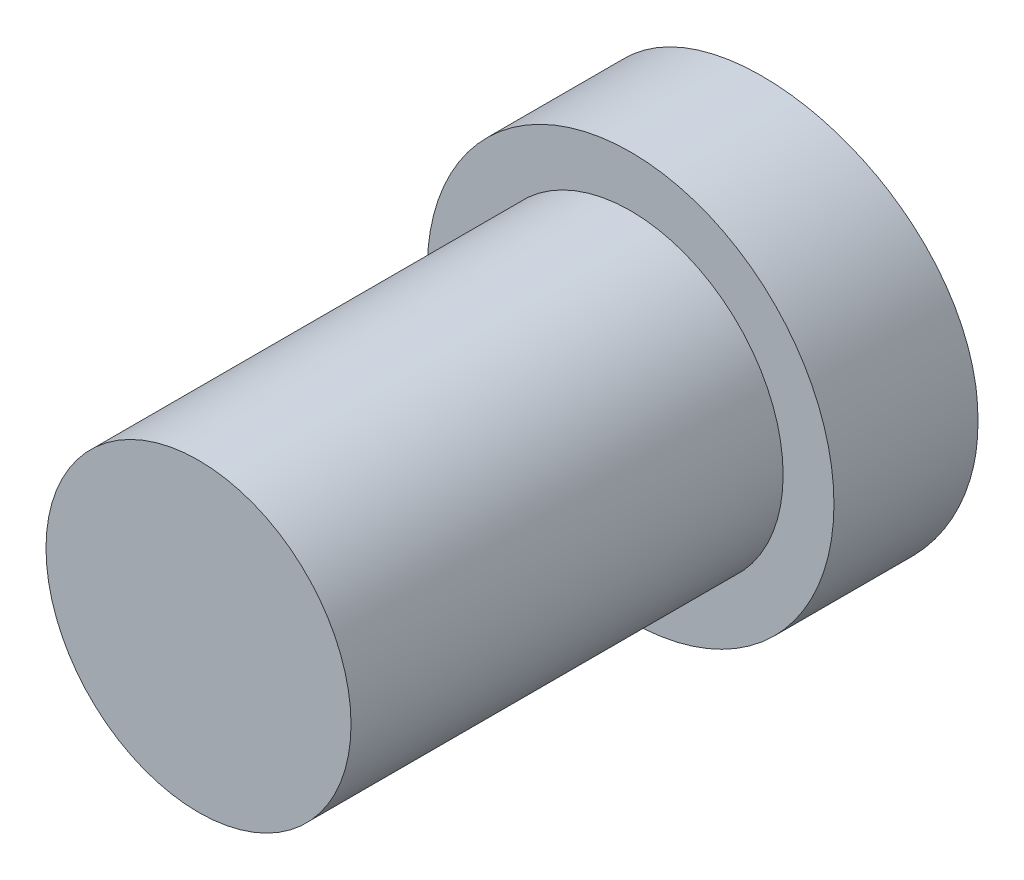
ISO-10303-21;
HEADER;
FILE_DESCRIPTION(('STEP AP214'),'2;1');
FILE_NAME('part.step','',(''),(''),'','','');
FILE_SCHEMA(('AUTOMOTIVE_DESIGN { 1 0 10303 214 1 1 1 1 }'));
ENDSEC;
DATA;
#1=APPLICATION_CONTEXT('core data for automotive mechanical design processes');
#2=APPLICATION_PROTOCOL_DEFINITION('international standard','automotive_design',2000,#1);
#3=PRODUCT_CONTEXT('',#1,'mechanical');
#4=PRODUCT('Part','Part','',(#3));
#5=PRODUCT_RELATED_PRODUCT_CATEGORY('part','',(#4));
#6=PRODUCT_DEFINITION_FORMATION('','',#4);
#7=PRODUCT_DEFINITION_CONTEXT('part definition',#1,'design');
#8=PRODUCT_DEFINITION('design','',#6,#7);
#9=PRODUCT_DEFINITION_SHAPE('','',#8);
#10=(LENGTH_UNIT() NAMED_UNIT(*) SI_UNIT(.MILLI.,.METRE.));
#11=(NAMED_UNIT(*) PLANE_ANGLE_UNIT() SI_UNIT($,.RADIAN.));
#12=(NAMED_UNIT(*) SI_UNIT($,.STERADIAN.) SOLID_ANGLE_UNIT());
#13=UNCERTAINTY_MEASURE_WITH_UNIT(LENGTH_MEASURE(1.E-05),#10,'distance_accuracy_value','');
#14=(GEOMETRIC_REPRESENTATION_CONTEXT(3) GLOBAL_UNCERTAINTY_ASSIGNED_CONTEXT((#13)) GLOBAL_UNIT_ASSIGNED_CONTEXT((#10,
#11,#12)) REPRESENTATION_CONTEXT('',''));
#15=CARTESIAN_POINT('',(0.,0.,0.));
#16=DIRECTION('',(0.,0.,1.));
#17=DIRECTION('',(1.,0.,0.));
#18=AXIS2_PLACEMENT_3D('',#15,#16,#17);
#19=CARTESIAN_POINT('',(0.,0.,17.));
#20=DIRECTION('',(0.,0.,-1.));
#21=DIRECTION('',(-1.,0.,0.));
#22=AXIS2_PLACEMENT_3D('',#19,#20,#21);
#23=CYLINDRICAL_SURFACE('',#22,4.5);
#24=CARTESIAN_POINT('',(0.,0.,4.25));
#25=DIRECTION('',(0.,0.,1.));
#26=DIRECTION('',(1.,0.,0.));
#27=AXIS2_PLACEMENT_3D('',#24,#25,#26);
#28=CIRCLE('',#27,4.5);
#29=CARTESIAN_POINT('',(4.5,0.,4.25));
#30=VERTEX_POINT('',#29);
#31=EDGE_CURVE('E74',#30,#30,#28,.T.);
#32=ORIENTED_EDGE('',*,*,#31,.T.);
#33=EDGE_LOOP('',(#32));
#34=FACE_BOUND('',#33,.T.);
#35=CARTESIAN_POINT('',(0.,0.,17.));
#36=DIRECTION('',(0.,0.,1.));
#37=DIRECTION('',(1.,0.,0.));
#38=AXIS2_PLACEMENT_3D('',#35,#36,#37);
#39=CIRCLE('',#38,4.5);
#40=CARTESIAN_POINT('',(4.5,0.,17.));
#41=VERTEX_POINT('',#40);
#42=EDGE_CURVE('E72',#41,#41,#39,.T.);
#43=ORIENTED_EDGE('',*,*,#42,.F.);
#44=EDGE_LOOP('',(#43));
#45=FACE_BOUND('',#44,.T.);
#46=ADVANCED_FACE('F37',(#34,#45),#23,.T.);
#47=CARTESIAN_POINT('',(0.,0.,17.));
#48=DIRECTION('',(0.,0.,1.));
#49=DIRECTION('',(1.,0.,0.));
#50=AXIS2_PLACEMENT_3D('',#47,#48,#49);
#51=PLANE('',#50);
#52=ORIENTED_EDGE('',*,*,#42,.T.);
#53=EDGE_LOOP('',(#52));
#54=FACE_BOUND('',#53,.T.);
#55=ADVANCED_FACE('F96',(#54),#51,.T.);
#56=CARTESIAN_POINT('',(0.,0.,4.25));
#57=DIRECTION('',(0.,0.,1.));
#58=DIRECTION('',(1.,0.,0.));
#59=AXIS2_PLACEMENT_3D('',#56,#57,#58);
#60=PLANE('',#59);
#61=CARTESIAN_POINT('',(0.,0.,4.25));
#62=DIRECTION('',(0.,0.,1.));
#63=DIRECTION('',(1.,0.,0.));
#64=AXIS2_PLACEMENT_3D('',#61,#62,#63);
#65=CIRCLE('',#64,6.);
#66=CARTESIAN_POINT('',(6.,0.,4.25));
#67=VERTEX_POINT('',#66);
#68=EDGE_CURVE('E76',#67,#67,#65,.T.);
#69=ORIENTED_EDGE('',*,*,#68,.T.);
#70=EDGE_LOOP('',(#69));
#71=FACE_BOUND('',#70,.T.);
#72=ORIENTED_EDGE('',*,*,#31,.F.);
#73=EDGE_LOOP('',(#72));
#74=FACE_BOUND('',#73,.T.);
#75=ADVANCED_FACE('F87',(#71,#74),#60,.T.);
#76=CARTESIAN_POINT('',(0.,0.,4.25));
#77=DIRECTION('',(0.,0.,-1.));
#78=DIRECTION('',(-1.,0.,0.));
#79=AXIS2_PLACEMENT_3D('',#76,#77,#78);
#80=CYLINDRICAL_SURFACE('',#79,6.);
#81=ORIENTED_EDGE('',*,*,#68,.F.);
#82=EDGE_LOOP('',(#81));
#83=FACE_BOUND('',#82,.T.);
#84=CARTESIAN_POINT('',(0.,0.,0.));
#85=DIRECTION('',(0.,0.,1.));
#86=DIRECTION('',(1.,0.,0.));
#87=AXIS2_PLACEMENT_3D('',#84,#85,#86);
#88=CIRCLE('',#87,6.);
#89=CARTESIAN_POINT('',(5.94043800538457,-0.843324554476254,0.));
#90=VERTEX_POINT('',#89);
#91=CARTESIAN_POINT('',(5.94043800538457,0.843324554476254,0.));
#92=VERTEX_POINT('',#91);
#93=EDGE_CURVE('E66',#90,#92,#88,.T.);
#94=ORIENTED_EDGE('',*,*,#93,.T.);
#95=CARTESIAN_POINT('',(5.94043800538457,0.843324554476254,0.));
#96=CARTESIAN_POINT('',(5.91677642733934,1.01013088972609,0.00293024071461757));
#97=CARTESIAN_POINT('',(5.88605596566407,1.17591498856815,0.00673077304603096));
#98=CARTESIAN_POINT('',(5.81080943156231,1.50426035828322,0.0159286948526426));
#99=CARTESIAN_POINT('',(5.76628456013719,1.66682190821359,0.0213259454094368));
#100=CARTESIAN_POINT('',(5.66378694965089,1.98741744846943,0.0335681878827217));
#101=CARTESIAN_POINT('',(5.60582731662964,2.14545568370893,0.040411768287692));
#102=CARTESIAN_POINT('',(5.47686619801592,2.4560554224881,0.055354394981101));
#103=CARTESIAN_POINT('',(5.40586474133532,2.60861693816799,0.0634534384863511));
#104=CARTESIAN_POINT('',(5.25132368047521,2.90720892407216,0.0806808901688044));
#105=CARTESIAN_POINT('',(5.16778285777555,3.05323875778441,0.0898093983633755));
#106=CARTESIAN_POINT('',(4.98873144272483,3.33778755005306,0.108842421221449));
#107=CARTESIAN_POINT('',(4.8932164366517,3.4763037119333,0.118747221521477));
#108=CARTESIAN_POINT('',(4.69096110943997,3.74474474176435,0.139047644647634));
#109=CARTESIAN_POINT('',(4.58422590592268,3.87467348284033,0.149443042526288));
#110=CARTESIAN_POINT('',(4.36019900950642,4.1251554488433,0.170441604476649));
#111=CARTESIAN_POINT('',(4.24290342000339,4.24570518223722,0.181044844100209));
#112=CARTESIAN_POINT('',(3.99808026007789,4.477034553754,0.202203215023437));
#113=CARTESIAN_POINT('',(3.87051097825322,4.58777008892451,0.212757945173269));
#114=CARTESIAN_POINT('',(3.60642375719084,4.79814739237764,0.233477672614563));
#115=CARTESIAN_POINT('',(3.46990252018668,4.89778503547096,0.243642524070116));
#116=CARTESIAN_POINT('',(3.18894297312562,5.08518930577852,0.263286408415989));
#117=CARTESIAN_POINT('',(3.04450660166614,5.17295882166896,0.27276560793031));
#118=CARTESIAN_POINT('',(2.7486451840167,5.33605599379873,0.290773059533175));
#119=CARTESIAN_POINT('',(2.59721758809804,5.41137906416945,0.299300960743361));
#120=CARTESIAN_POINT('',(2.28862340890531,5.54893834787478,0.315149630642946));
#121=CARTESIAN_POINT('',(2.13146180263916,5.6111856078426,0.322471417137587));
#122=CARTESIAN_POINT('',(1.81233504533732,5.72223693018864,0.335707546337629));
#123=CARTESIAN_POINT('',(1.65036814259922,5.7710360218429,0.341621368520393));
#124=CARTESIAN_POINT('',(1.32291981780095,5.85477830277397,0.351863898359647));
#125=CARTESIAN_POINT('',(1.15744002090128,5.88972775818029,0.35619332279308));
#126=CARTESIAN_POINT('',(0.824027775131172,5.94554939854173,0.363145755364356));
#127=CARTESIAN_POINT('',(0.656094498621909,5.9664167156224,0.365768173417888));
#128=CARTESIAN_POINT('',(0.320251024344622,5.99379861981964,0.369215130017763));
#129=CARTESIAN_POINT('',(0.15234921358913,6.0004145661168,0.370052364781809));
#130=CARTESIAN_POINT('',(-0.183417181435392,5.99954521637311,0.369942555349901));
#131=CARTESIAN_POINT('',(-0.35128176580402,5.99205995852554,0.368995515986674));
#132=CARTESIAN_POINT('',(-0.685801436375886,5.96304181572248,0.365344213062507));
#133=CARTESIAN_POINT('',(-0.852456312492545,5.941506547094,0.362639651327116));
#134=CARTESIAN_POINT('',(-1.18328157936703,5.88455667102528,0.355552302537452));
#135=CARTESIAN_POINT('',(-1.34745280761388,5.84914685556203,0.351170094918809));
#136=CARTESIAN_POINT('',(-1.6718414553961,5.76480433654719,0.340864939199222));
#137=CARTESIAN_POINT('',(-1.83206689115426,5.71590203154439,0.334945456316858));
#138=CARTESIAN_POINT('',(-2.1477615986099,5.60491795623095,0.321732255266379));
#139=CARTESIAN_POINT('',(-2.30323257620948,5.54284097801187,0.314439036882343));
#140=CARTESIAN_POINT('',(-2.6084540289455,5.40591852691672,0.298680640687631));
#141=CARTESIAN_POINT('',(-2.75820234429682,5.33106829042248,0.290215025869963));
#142=CARTESIAN_POINT('',(-3.0508283902215,5.16917751283063,0.272355862561678));
#143=CARTESIAN_POINT('',(-3.19370856207247,5.08214134690455,0.262962647466865));
#144=CARTESIAN_POINT('',(-3.47252837336416,4.89589885004706,0.24344921036951));
#145=CARTESIAN_POINT('',(-3.60841998167321,4.79662103756754,0.233324876573355));
#146=CARTESIAN_POINT('',(-3.8713214485145,4.58705991081214,0.212690493279756));
#147=CARTESIAN_POINT('',(-3.99833449714539,4.4767805843477,0.202180584412056));
#148=CARTESIAN_POINT('',(-4.24272237947015,4.24588996802773,0.181061147996236));
#149=CARTESIAN_POINT('',(-4.36009171323908,4.12527286142963,0.170451567394933));
#150=CARTESIAN_POINT('',(-4.58425385929102,3.87464478082186,0.149440516563629));
#151=CARTESIAN_POINT('',(-4.69105053029149,3.74463726422801,0.139038971520889));
#152=CARTESIAN_POINT('',(-4.89397312833835,3.47528811370461,0.118670967741575));
#153=CARTESIAN_POINT('',(-4.99003159857565,3.33589542377031,0.108707474669093));
#154=CARTESIAN_POINT('',(-5.17001872377311,3.04950804438188,0.089568403984952));
#155=CARTESIAN_POINT('',(-5.2539518674405,2.90251619558505,0.0803925353136466));
#156=CARTESIAN_POINT('',(-5.40907427657606,2.6020158885669,0.0630908532018045));
#157=CARTESIAN_POINT('',(-5.48027172163848,2.44851169190393,0.054964366727604));
#158=CARTESIAN_POINT('',(-5.60944703502118,2.13604258298197,0.039987541949072));
#159=CARTESIAN_POINT('',(-5.66742973129011,1.97707968953563,0.0331367377479049));
#160=CARTESIAN_POINT('',(-5.76900951630262,1.65718284532923,0.0209965650907786));
#161=CARTESIAN_POINT('',(-5.81280862593306,1.49631384549054,0.0156853934208172));
#162=CARTESIAN_POINT('',(-5.88682909900196,1.17173356633767,0.00663527128809052));
#163=CARTESIAN_POINT('',(-5.9170739170751,1.00802770999909,0.00289360564268412));
#164=CARTESIAN_POINT('',(-5.94043800538457,0.843324554476255,0.));
#165=B_SPLINE_CURVE_WITH_KNOTS('',3,(#95,#96,#97,#98,#99,#100,#101,#102,#103,#104,#105,#106,
#107,#108,#109,#110,#111,#112,#113,#114,#115,#116,#117,#118,#119,#120,#121,#122,#123,#124,#125,
#126,#127,#128,#129,#130,#131,#132,#133,#134,#135,#136,#137,#138,#139,#140,#141,#142,#143,#144,
#145,#146,#147,#148,#149,#150,#151,#152,#153,#154,#155,#156,#157,#158,#159,#160,#161,#162,#163,
#164),.UNSPECIFIED.,.F.,.F.,(4,2,2,2,2,2,2,2,2,2,2,2,2,2,2,2,2,2,2,2,2,2,2,2,2,2,2,2,2,2,2,2,2,
2,4),(0.,0.505345757941087,1.0106475624845,1.51545848822533,2.02026829488593,2.52512718852942,
3.03017272496311,3.53498889745434,4.03999210801478,4.54716040974031,5.05451660588502,
5.56174908949935,6.06916804721624,6.57615659056916,7.08333227690461,7.59027823396174,
8.09739934104775,8.6009016060993,9.10440250741073,9.607988853048,10.1114014236342,
10.6136889402054,11.1157940693247,11.6180868627926,12.1201997759822,12.6253973795941,
13.1304125207971,13.6357137073807,14.1408297883757,14.6489591348097,15.1568998907833,
15.6645132375784,16.1719408317787,16.6717857791028,17.1707624123992),.UNSPECIFIED.);
#166=CARTESIAN_POINT('',(-5.94043800538457,0.843324554476254,0.));
#167=VERTEX_POINT('',#166);
#168=EDGE_CURVE('E57',#92,#167,#165,.T.);
#169=ORIENTED_EDGE('',*,*,#168,.T.);
#170=CARTESIAN_POINT('',(-5.94043800538457,-0.843324554476254,0.));
#171=VERTEX_POINT('',#170);
#172=EDGE_CURVE('E68',#167,#171,#88,.T.);
#173=ORIENTED_EDGE('',*,*,#172,.T.);
#174=CARTESIAN_POINT('',(-5.94043800538457,-0.843324554476254,0.));
#175=CARTESIAN_POINT('',(-5.91677642733934,-1.01013088972609,0.00293024071461774));
#176=CARTESIAN_POINT('',(-5.88605596566407,-1.17591498856815,0.00673077304603124));
#177=CARTESIAN_POINT('',(-5.81080943156231,-1.50426035828322,0.015928694852643));
#178=CARTESIAN_POINT('',(-5.76628456013719,-1.66682190821359,0.0213259454094372));
#179=CARTESIAN_POINT('',(-5.66378694965089,-1.98741744846943,0.0335681878827221));
#180=CARTESIAN_POINT('',(-5.60582731662964,-2.14545568370893,0.0404117682876923));
#181=CARTESIAN_POINT('',(-5.47686619801592,-2.4560554224881,0.0553543949811012));
#182=CARTESIAN_POINT('',(-5.40586474133532,-2.60861693816799,0.0634534384863512));
#183=CARTESIAN_POINT('',(-5.25132368047521,-2.90720892407216,0.0806808901688044));
#184=CARTESIAN_POINT('',(-5.16778285777555,-3.05323875778441,0.0898093983633755));
#185=CARTESIAN_POINT('',(-4.98873144272483,-3.33778755005306,0.108842421221448));
#186=CARTESIAN_POINT('',(-4.8932164366517,-3.4763037119333,0.118747221521477));
#187=CARTESIAN_POINT('',(-4.69096110943997,-3.74474474176435,0.139047644647634));
#188=CARTESIAN_POINT('',(-4.58422590592268,-3.87467348284033,0.149443042526288));
#189=CARTESIAN_POINT('',(-4.36019900950642,-4.1251554488433,0.170441604476649));
#190=CARTESIAN_POINT('',(-4.24290342000339,-4.24570518223722,0.181044844100208));
#191=CARTESIAN_POINT('',(-3.99808026007789,-4.477034553754,0.202203215023437));
#192=CARTESIAN_POINT('',(-3.87051097825322,-4.58777008892451,0.212757945173269));
#193=CARTESIAN_POINT('',(-3.60642375719084,-4.79814739237764,0.233477672614564));
#194=CARTESIAN_POINT('',(-3.46990252018668,-4.89778503547096,0.243642524070118));
#195=CARTESIAN_POINT('',(-3.18894297312562,-5.08518930577852,0.263286408415989));
#196=CARTESIAN_POINT('',(-3.04450660166614,-5.17295882166896,0.272765607930309));
#197=CARTESIAN_POINT('',(-2.7486451840167,-5.33605599379873,0.290773059533174));
#198=CARTESIAN_POINT('',(-2.59721758809804,-5.41137906416945,0.299300960743362));
#199=CARTESIAN_POINT('',(-2.28862340890531,-5.54893834787478,0.315149630642946));
#200=CARTESIAN_POINT('',(-2.13146180263916,-5.6111856078426,0.322471417137585));
#201=CARTESIAN_POINT('',(-1.81233504533733,-5.72223693018864,0.335707546337631));
#202=CARTESIAN_POINT('',(-1.65036814259922,-5.7710360218429,0.341621368520401));
#203=CARTESIAN_POINT('',(-1.32291981780095,-5.85477830277397,0.351863898359659));
#204=CARTESIAN_POINT('',(-1.15744002090128,-5.88972775818029,0.356193322793089));
#205=CARTESIAN_POINT('',(-0.824027775131172,-5.94554939854173,0.363145755364356));
#206=CARTESIAN_POINT('',(-0.656094498621909,-5.9664167156224,0.365768173417882));
#207=CARTESIAN_POINT('',(-0.320251024344621,-5.99379861981964,0.369215130017755));
#208=CARTESIAN_POINT('',(-0.15234921358913,-6.0004145661168,0.370052364781807));
#209=CARTESIAN_POINT('',(0.183417181435392,-5.99954521637311,0.369942555349901));
#210=CARTESIAN_POINT('',(0.35128176580402,-5.99205995852554,0.368995515986671));
#211=CARTESIAN_POINT('',(0.685801436375886,-5.96304181572248,0.365344213062503));
#212=CARTESIAN_POINT('',(0.852456312492546,-5.941506547094,0.362639651327114));
#213=CARTESIAN_POINT('',(1.18328157936703,-5.88455667102528,0.355552302537453));
#214=CARTESIAN_POINT('',(1.34745280761388,-5.84914685556203,0.351170094918809));
#215=CARTESIAN_POINT('',(1.6718414553961,-5.76480433654719,0.340864939199223));
#216=CARTESIAN_POINT('',(1.83206689115426,-5.71590203154439,0.334945456316859));
#217=CARTESIAN_POINT('',(2.1477615986099,-5.60491795623095,0.32173225526638));
#218=CARTESIAN_POINT('',(2.30323257620948,-5.54284097801187,0.314439036882345));
#219=CARTESIAN_POINT('',(2.6084540289455,-5.40591852691672,0.298680640687633));
#220=CARTESIAN_POINT('',(2.75820234429682,-5.33106829042248,0.290215025869964));
#221=CARTESIAN_POINT('',(3.0508283902215,-5.16917751283064,0.272355862561679));
#222=CARTESIAN_POINT('',(3.19370856207247,-5.08214134690455,0.262962647466866));
#223=CARTESIAN_POINT('',(3.47252837336416,-4.89589885004706,0.243449210369511));
#224=CARTESIAN_POINT('',(3.60841998167321,-4.79662103756754,0.233324876573356));
#225=CARTESIAN_POINT('',(3.8713214485145,-4.58705991081214,0.212690493279757));
#226=CARTESIAN_POINT('',(3.99833449714539,-4.4767805843477,0.202180584412057));
#227=CARTESIAN_POINT('',(4.24272237947015,-4.24588996802773,0.181061147996236));
#228=CARTESIAN_POINT('',(4.36009171323907,-4.12527286142963,0.170451567394933));
#229=CARTESIAN_POINT('',(4.58425385929102,-3.87464478082186,0.149440516563628));
#230=CARTESIAN_POINT('',(4.69105053029149,-3.74463726422801,0.139038971520889));
#231=CARTESIAN_POINT('',(4.89397312833835,-3.47528811370461,0.118670967741577));
#232=CARTESIAN_POINT('',(4.99003159857565,-3.33589542377031,0.108707474669098));
#233=CARTESIAN_POINT('',(5.17001872377311,-3.04950804438188,0.089568403984954));
#234=CARTESIAN_POINT('',(5.2539518674405,-2.90251619558505,0.0803925353136424));
#235=CARTESIAN_POINT('',(5.40907427657606,-2.6020158885669,0.0630908532017968));
#236=CARTESIAN_POINT('',(5.48027172163848,-2.44851169190393,0.0549643667275991));
#237=CARTESIAN_POINT('',(5.60944703502118,-2.13604258298198,0.0399875419490711));
#238=CARTESIAN_POINT('',(5.66742973129011,-1.97707968953563,0.0331367377479054));
#239=CARTESIAN_POINT('',(5.76900951630262,-1.65718284532923,0.0209965650907801));
#240=CARTESIAN_POINT('',(5.81280862593306,-1.49631384549054,0.0156853934208185));
#241=CARTESIAN_POINT('',(5.88682909900196,-1.17173356633768,0.00663527128809127));
#242=CARTESIAN_POINT('',(5.9170739170751,-1.00802770999909,0.0028936056426846));
#243=CARTESIAN_POINT('',(5.94043800538457,-0.843324554476256,0.));
#244=B_SPLINE_CURVE_WITH_KNOTS('',3,(#174,#175,#176,#177,#178,#179,#180,#181,#182,#183,#184,
#185,#186,#187,#188,#189,#190,#191,#192,#193,#194,#195,#196,#197,#198,#199,#200,#201,#202,#203,
#204,#205,#206,#207,#208,#209,#210,#211,#212,#213,#214,#215,#216,#217,#218,#219,#220,#221,#222,
#223,#224,#225,#226,#227,#228,#229,#230,#231,#232,#233,#234,#235,#236,#237,#238,#239,#240,#241,
#242,#243),.UNSPECIFIED.,.F.,.F.,(4,2,2,2,2,2,2,2,2,2,2,2,2,2,2,2,2,2,2,2,2,2,2,2,2,2,2,2,2,2,2,
2,2,2,4),(0.,0.505345757941087,1.0106475624845,1.51545848822533,2.02026829488593,
2.52512718852942,3.03017272496311,3.53498889745434,4.03999210801478,4.54716040974031,
5.05451660588502,5.56174908949935,6.06916804721624,6.57615659056916,7.08333227690461,
7.59027823396174,8.09739934104775,8.6009016060993,9.10440250741073,9.607988853048,
10.1114014236342,10.6136889402054,11.1157940693247,11.6180868627926,12.1201997759822,
12.6253973795941,13.1304125207971,13.6357137073807,14.1408297883757,14.6489591348097,
15.1568998907833,15.6645132375784,16.1719408317787,16.6717857791028,17.1707624123992),.UNSPECIFIED.);
#245=EDGE_CURVE('E50',#171,#90,#244,.T.);
#246=ORIENTED_EDGE('',*,*,#245,.T.);
#247=EDGE_LOOP('',(#94,#169,#173,#246));
#248=FACE_BOUND('',#247,.T.);
#249=ADVANCED_FACE('F64',(#83,#248),#80,.T.);
#250=CARTESIAN_POINT('',(0.,0.,0.));
#251=DIRECTION('',(0.,0.,1.));
#252=DIRECTION('',(1.,0.,0.));
#253=AXIS2_PLACEMENT_3D('',#250,#251,#252);
#254=PLANE('',#253);
#255=ORIENTED_EDGE('',*,*,#172,.F.);
#256=DIRECTION('',(1.,0.,0.));
#257=VECTOR('',#256,1.);
#258=CARTESIAN_POINT('',(-6.,0.843324554476254,0.));
#259=LINE('',#258,#257);
#260=EDGE_CURVE('E11',#167,#92,#259,.T.);
#261=ORIENTED_EDGE('',*,*,#260,.T.);
#262=ORIENTED_EDGE('',*,*,#93,.F.);
#263=DIRECTION('',(1.,0.,0.));
#264=VECTOR('',#263,1.);
#265=CARTESIAN_POINT('',(-6.,-0.843324554476254,0.));
#266=LINE('',#265,#264);
#267=EDGE_CURVE('E44',#90,#171,#266,.F.);
#268=ORIENTED_EDGE('',*,*,#267,.T.);
#269=EDGE_LOOP('',(#255,#261,#262,#268));
#270=FACE_BOUND('',#269,.T.);
#271=ADVANCED_FACE('F73',(#270),#254,.F.);
#272=CARTESIAN_POINT('',(-6.,0.,47.872572561915));
#273=DIRECTION('',(1.,0.,0.));
#274=DIRECTION('',(0.,0.,-1.));
#275=AXIS2_PLACEMENT_3D('',#272,#273,#274);
#276=CYLINDRICAL_SURFACE('',#275,47.88);
#277=ORIENTED_EDGE('',*,*,#267,.F.);
#278=ORIENTED_EDGE('',*,*,#245,.F.);
#279=EDGE_LOOP('',(#277,#278));
#280=FACE_BOUND('',#279,.T.);
#281=ADVANCED_FACE('F70',(#280),#276,.T.);
#282=CARTESIAN_POINT('',(-6.,0.,47.872572561915));
#283=DIRECTION('',(1.,0.,0.));
#284=DIRECTION('',(0.,0.,-1.));
#285=AXIS2_PLACEMENT_3D('',#282,#283,#284);
#286=CYLINDRICAL_SURFACE('',#285,47.88);
#287=ORIENTED_EDGE('',*,*,#260,.F.);
#288=ORIENTED_EDGE('',*,*,#168,.F.);
#289=EDGE_LOOP('',(#287,#288));
#290=FACE_BOUND('',#289,.T.);
#291=ADVANCED_FACE('F137',(#290),#286,.T.);
#292=CLOSED_SHELL('',(#46,#55,#75,#249,#271,#281,#291));
#293=MANIFOLD_SOLID_BREP('B2',#292);
#294=ADVANCED_BREP_SHAPE_REPRESENTATION('',(#18,#293),#14);
#295=SHAPE_DEFINITION_REPRESENTATION(#9,#294);
ENDSEC;
END-ISO-10303-21;
